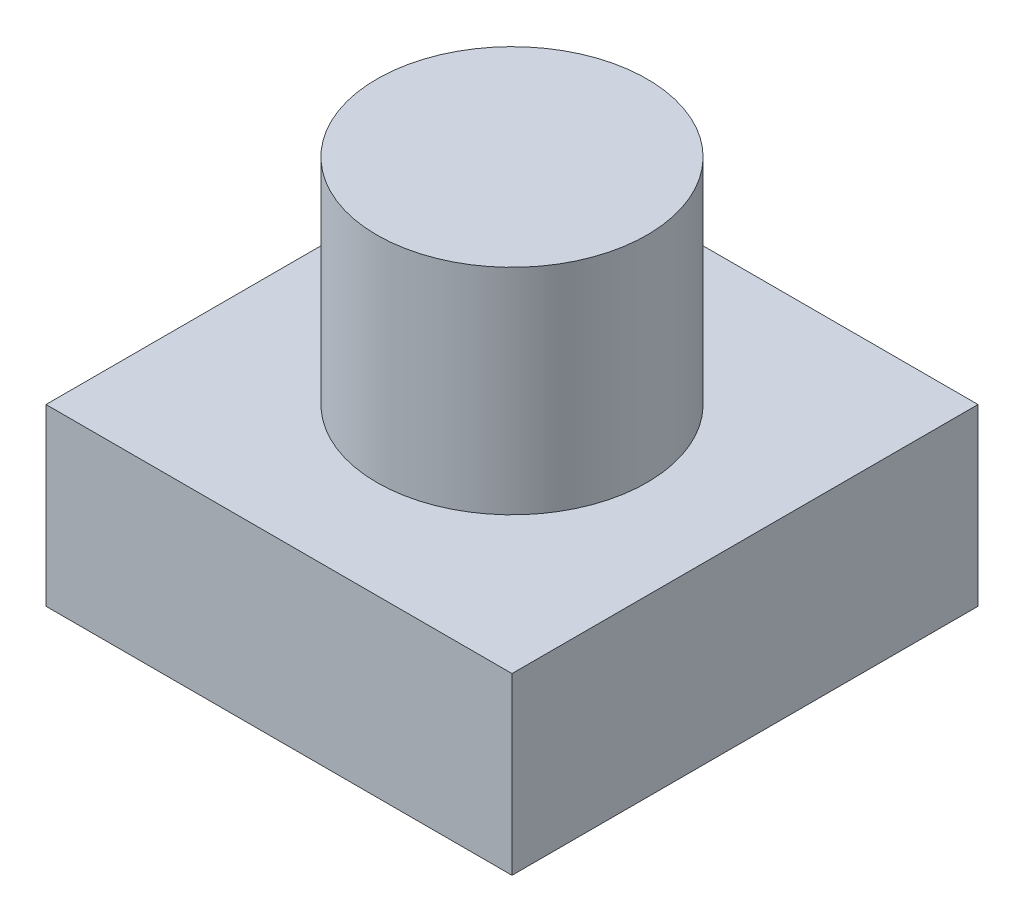
ISO-10303-21;
HEADER;
FILE_DESCRIPTION(('STEP AP214'),'2;1');
FILE_NAME('part.step','',(''),(''),'','','');
FILE_SCHEMA(('AUTOMOTIVE_DESIGN { 1 0 10303 214 1 1 1 1 }'));
ENDSEC;
DATA;
#1=APPLICATION_CONTEXT('core data for automotive mechanical design processes');
#2=APPLICATION_PROTOCOL_DEFINITION('international standard','automotive_design',2000,#1);
#3=PRODUCT_CONTEXT('',#1,'mechanical');
#4=PRODUCT('Part','Part','',(#3));
#5=PRODUCT_RELATED_PRODUCT_CATEGORY('part','',(#4));
#6=PRODUCT_DEFINITION_FORMATION('','',#4);
#7=PRODUCT_DEFINITION_CONTEXT('part definition',#1,'design');
#8=PRODUCT_DEFINITION('design','',#6,#7);
#9=PRODUCT_DEFINITION_SHAPE('','',#8);
#10=(LENGTH_UNIT() NAMED_UNIT(*) SI_UNIT(.MILLI.,.METRE.));
#11=(NAMED_UNIT(*) PLANE_ANGLE_UNIT() SI_UNIT($,.RADIAN.));
#12=(NAMED_UNIT(*) SI_UNIT($,.STERADIAN.) SOLID_ANGLE_UNIT());
#13=UNCERTAINTY_MEASURE_WITH_UNIT(LENGTH_MEASURE(1.E-05),#10,'distance_accuracy_value','');
#14=(GEOMETRIC_REPRESENTATION_CONTEXT(3) GLOBAL_UNCERTAINTY_ASSIGNED_CONTEXT((#13)) GLOBAL_UNIT_ASSIGNED_CONTEXT((#10,
#11,#12)) REPRESENTATION_CONTEXT('',''));
#15=CARTESIAN_POINT('',(0.,0.,0.));
#16=DIRECTION('',(0.,0.,1.));
#17=DIRECTION('',(1.,0.,0.));
#18=AXIS2_PLACEMENT_3D('',#15,#16,#17);
#19=CARTESIAN_POINT('',(0.,5.842,0.));
#20=DIRECTION('',(0.,-1.,0.));
#21=DIRECTION('',(0.,0.,-1.));
#22=AXIS2_PLACEMENT_3D('',#19,#20,#21);
#23=CYLINDRICAL_SURFACE('',#22,3.683);
#24=CARTESIAN_POINT('',(0.,5.842,0.));
#25=DIRECTION('',(0.,1.,0.));
#26=DIRECTION('',(0.,0.,1.));
#27=AXIS2_PLACEMENT_3D('',#24,#25,#26);
#28=CIRCLE('',#27,3.683);
#29=CARTESIAN_POINT('',(0.,5.842,3.683));
#30=VERTEX_POINT('',#29);
#31=EDGE_CURVE('E11',#30,#30,#28,.T.);
#32=ORIENTED_EDGE('',*,*,#31,.F.);
#33=EDGE_LOOP('',(#32));
#34=FACE_BOUND('',#33,.T.);
#35=CARTESIAN_POINT('',(0.,0.,0.));
#36=DIRECTION('',(0.,1.,0.));
#37=DIRECTION('',(0.,0.,1.));
#38=AXIS2_PLACEMENT_3D('',#35,#36,#37);
#39=CIRCLE('',#38,3.683);
#40=CARTESIAN_POINT('',(0.,0.,3.683));
#41=VERTEX_POINT('',#40);
#42=EDGE_CURVE('E44',#41,#41,#39,.T.);
#43=ORIENTED_EDGE('',*,*,#42,.T.);
#44=EDGE_LOOP('',(#43));
#45=FACE_BOUND('',#44,.T.);
#46=ADVANCED_FACE('F41',(#34,#45),#23,.T.);
#47=CARTESIAN_POINT('',(0.,5.842,0.));
#48=DIRECTION('',(0.,1.,0.));
#49=DIRECTION('',(0.,0.,1.));
#50=AXIS2_PLACEMENT_3D('',#47,#48,#49);
#51=PLANE('',#50);
#52=ORIENTED_EDGE('',*,*,#31,.T.);
#53=EDGE_LOOP('',(#52));
#54=FACE_BOUND('',#53,.T.);
#55=ADVANCED_FACE('F150',(#54),#51,.T.);
#56=CARTESIAN_POINT('',(-6.35,-4.7625,6.35));
#57=DIRECTION('',(1.,0.,0.));
#58=DIRECTION('',(0.,0.,-1.));
#59=AXIS2_PLACEMENT_3D('',#56,#57,#58);
#60=PLANE('',#59);
#61=DIRECTION('',(0.,0.,-1.));
#62=VECTOR('',#61,1.);
#63=CARTESIAN_POINT('',(-6.35,0.,6.35));
#64=LINE('',#63,#62);
#65=CARTESIAN_POINT('',(-6.35,0.,6.35));
#66=VERTEX_POINT('',#65);
#67=CARTESIAN_POINT('',(-6.35,0.,-6.35));
#68=VERTEX_POINT('',#67);
#69=EDGE_CURVE('E113',#66,#68,#64,.T.);
#70=ORIENTED_EDGE('',*,*,#69,.T.);
#71=DIRECTION('',(0.,1.,0.));
#72=VECTOR('',#71,1.);
#73=CARTESIAN_POINT('',(-6.35,-4.7625,-6.35));
#74=LINE('',#73,#72);
#75=CARTESIAN_POINT('',(-6.35,-4.7625,-6.35));
#76=VERTEX_POINT('',#75);
#77=EDGE_CURVE('E102',#76,#68,#74,.T.);
#78=ORIENTED_EDGE('',*,*,#77,.F.);
#79=DIRECTION('',(0.,0.,-1.));
#80=VECTOR('',#79,1.);
#81=CARTESIAN_POINT('',(-6.35,-4.7625,6.35));
#82=LINE('',#81,#80);
#83=CARTESIAN_POINT('',(-6.35,-4.7625,6.35));
#84=VERTEX_POINT('',#83);
#85=EDGE_CURVE('E94',#84,#76,#82,.T.);
#86=ORIENTED_EDGE('',*,*,#85,.F.);
#87=DIRECTION('',(0.,1.,0.));
#88=VECTOR('',#87,1.);
#89=CARTESIAN_POINT('',(-6.35,-4.7625,6.35));
#90=LINE('',#89,#88);
#91=EDGE_CURVE('E109',#84,#66,#90,.T.);
#92=ORIENTED_EDGE('',*,*,#91,.T.);
#93=EDGE_LOOP('',(#70,#78,#86,#92));
#94=FACE_BOUND('',#93,.T.);
#95=ADVANCED_FACE('F139',(#94),#60,.F.);
#96=CARTESIAN_POINT('',(6.35,-4.7625,-6.35));
#97=DIRECTION('',(0.,0.,1.));
#98=DIRECTION('',(1.,0.,0.));
#99=AXIS2_PLACEMENT_3D('',#96,#97,#98);
#100=PLANE('',#99);
#101=DIRECTION('',(1.,0.,0.));
#102=VECTOR('',#101,1.);
#103=CARTESIAN_POINT('',(6.35,0.,-6.35));
#104=LINE('',#103,#102);
#105=CARTESIAN_POINT('',(6.35,0.,-6.35));
#106=VERTEX_POINT('',#105);
#107=EDGE_CURVE('E100',#68,#106,#104,.T.);
#108=ORIENTED_EDGE('',*,*,#107,.T.);
#109=DIRECTION('',(0.,1.,0.));
#110=VECTOR('',#109,1.);
#111=CARTESIAN_POINT('',(6.35,-4.7625,-6.35));
#112=LINE('',#111,#110);
#113=CARTESIAN_POINT('',(6.35,-4.7625,-6.35));
#114=VERTEX_POINT('',#113);
#115=EDGE_CURVE('E98',#114,#106,#112,.T.);
#116=ORIENTED_EDGE('',*,*,#115,.F.);
#117=DIRECTION('',(1.,0.,0.));
#118=VECTOR('',#117,1.);
#119=CARTESIAN_POINT('',(6.35,-4.7625,-6.35));
#120=LINE('',#119,#118);
#121=EDGE_CURVE('E89',#76,#114,#120,.T.);
#122=ORIENTED_EDGE('',*,*,#121,.F.);
#123=ORIENTED_EDGE('',*,*,#77,.T.);
#124=EDGE_LOOP('',(#108,#116,#122,#123));
#125=FACE_BOUND('',#124,.T.);
#126=ADVANCED_FACE('F99',(#125),#100,.F.);
#127=CARTESIAN_POINT('',(6.35,-4.7625,6.35));
#128=DIRECTION('',(-1.,0.,0.));
#129=DIRECTION('',(0.,0.,1.));
#130=AXIS2_PLACEMENT_3D('',#127,#128,#129);
#131=PLANE('',#130);
#132=DIRECTION('',(0.,0.,1.));
#133=VECTOR('',#132,1.);
#134=CARTESIAN_POINT('',(6.35,0.,6.35));
#135=LINE('',#134,#133);
#136=CARTESIAN_POINT('',(6.35,0.,6.35));
#137=VERTEX_POINT('',#136);
#138=EDGE_CURVE('E75',#106,#137,#135,.T.);
#139=ORIENTED_EDGE('',*,*,#138,.T.);
#140=DIRECTION('',(0.,1.,0.));
#141=VECTOR('',#140,1.);
#142=CARTESIAN_POINT('',(6.35,-4.7625,6.35));
#143=LINE('',#142,#141);
#144=CARTESIAN_POINT('',(6.35,-4.7625,6.35));
#145=VERTEX_POINT('',#144);
#146=EDGE_CURVE('E103',#145,#137,#143,.T.);
#147=ORIENTED_EDGE('',*,*,#146,.F.);
#148=DIRECTION('',(0.,0.,1.));
#149=VECTOR('',#148,1.);
#150=CARTESIAN_POINT('',(6.35,-4.7625,6.35));
#151=LINE('',#150,#149);
#152=EDGE_CURVE('E92',#114,#145,#151,.T.);
#153=ORIENTED_EDGE('',*,*,#152,.F.);
#154=ORIENTED_EDGE('',*,*,#115,.T.);
#155=EDGE_LOOP('',(#139,#147,#153,#154));
#156=FACE_BOUND('',#155,.T.);
#157=ADVANCED_FACE('F105',(#156),#131,.F.);
#158=CARTESIAN_POINT('',(6.35,-4.7625,6.35));
#159=DIRECTION('',(0.,0.,-1.));
#160=DIRECTION('',(-1.,0.,0.));
#161=AXIS2_PLACEMENT_3D('',#158,#159,#160);
#162=PLANE('',#161);
#163=DIRECTION('',(-1.,0.,0.));
#164=VECTOR('',#163,1.);
#165=CARTESIAN_POINT('',(6.35,0.,6.35));
#166=LINE('',#165,#164);
#167=EDGE_CURVE('E81',#137,#66,#166,.T.);
#168=ORIENTED_EDGE('',*,*,#167,.T.);
#169=ORIENTED_EDGE('',*,*,#91,.F.);
#170=DIRECTION('',(-1.,0.,0.));
#171=VECTOR('',#170,1.);
#172=CARTESIAN_POINT('',(6.35,-4.7625,6.35));
#173=LINE('',#172,#171);
#174=EDGE_CURVE('E58',#145,#84,#173,.T.);
#175=ORIENTED_EDGE('',*,*,#174,.F.);
#176=ORIENTED_EDGE('',*,*,#146,.T.);
#177=EDGE_LOOP('',(#168,#169,#175,#176));
#178=FACE_BOUND('',#177,.T.);
#179=ADVANCED_FACE('F140',(#178),#162,.F.);
#180=CARTESIAN_POINT('',(0.,-4.7625,0.));
#181=DIRECTION('',(0.,1.,0.));
#182=DIRECTION('',(0.,0.,1.));
#183=AXIS2_PLACEMENT_3D('',#180,#181,#182);
#184=PLANE('',#183);
#185=ORIENTED_EDGE('',*,*,#85,.T.);
#186=ORIENTED_EDGE('',*,*,#121,.T.);
#187=ORIENTED_EDGE('',*,*,#152,.T.);
#188=ORIENTED_EDGE('',*,*,#174,.T.);
#189=EDGE_LOOP('',(#185,#186,#187,#188));
#190=FACE_BOUND('',#189,.T.);
#191=ADVANCED_FACE('F90',(#190),#184,.F.);
#192=CARTESIAN_POINT('',(0.,0.,0.));
#193=DIRECTION('',(0.,1.,0.));
#194=DIRECTION('',(0.,0.,1.));
#195=AXIS2_PLACEMENT_3D('',#192,#193,#194);
#196=PLANE('',#195);
#197=ORIENTED_EDGE('',*,*,#42,.F.);
#198=EDGE_LOOP('',(#197));
#199=FACE_BOUND('',#198,.T.);
#200=ORIENTED_EDGE('',*,*,#69,.F.);
#201=ORIENTED_EDGE('',*,*,#167,.F.);
#202=ORIENTED_EDGE('',*,*,#138,.F.);
#203=ORIENTED_EDGE('',*,*,#107,.F.);
#204=EDGE_LOOP('',(#200,#201,#202,#203));
#205=FACE_BOUND('',#204,.T.);
#206=ADVANCED_FACE('F133',(#199,#205),#196,.T.);
#207=CLOSED_SHELL('',(#46,#55,#95,#126,#157,#179,#191,#206));
#208=MANIFOLD_SOLID_BREP('B2',#207);
#209=ADVANCED_BREP_SHAPE_REPRESENTATION('',(#18,#208),#14);
#210=SHAPE_DEFINITION_REPRESENTATION(#9,#209);
ENDSEC;
END-ISO-10303-21;
